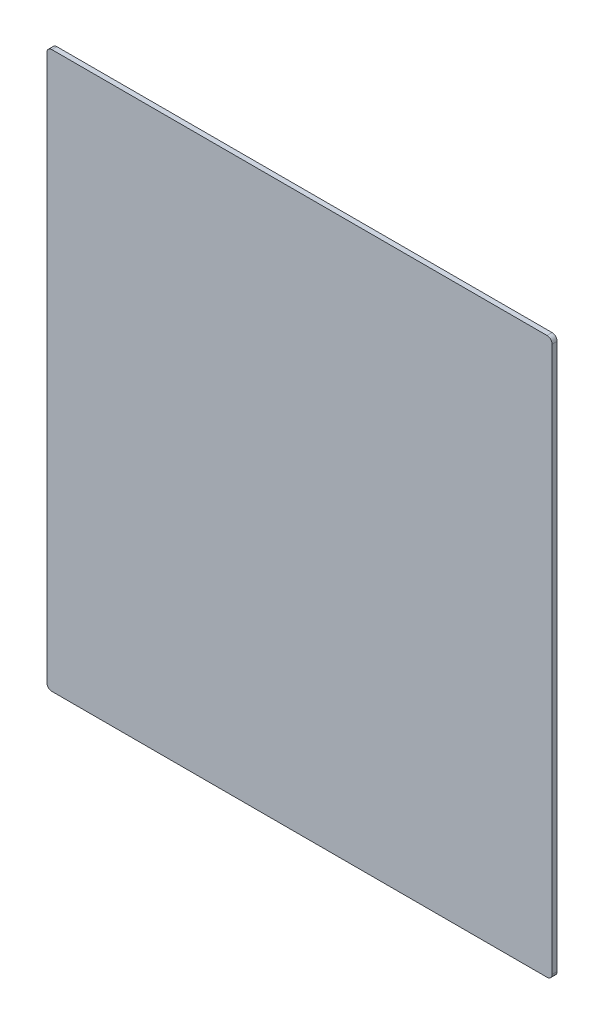
ISO-10303-21;
HEADER;
FILE_DESCRIPTION(('STEP AP214'),'2;1');
FILE_NAME('part.step','',(''),(''),'','','');
FILE_SCHEMA(('AUTOMOTIVE_DESIGN { 1 0 10303 214 1 1 1 1 }'));
ENDSEC;
DATA;
#1=APPLICATION_CONTEXT('core data for automotive mechanical design processes');
#2=APPLICATION_PROTOCOL_DEFINITION('international standard','automotive_design',2000,#1);
#3=PRODUCT_CONTEXT('',#1,'mechanical');
#4=PRODUCT('Part','Part','',(#3));
#5=PRODUCT_RELATED_PRODUCT_CATEGORY('part','',(#4));
#6=PRODUCT_DEFINITION_FORMATION('','',#4);
#7=PRODUCT_DEFINITION_CONTEXT('part definition',#1,'design');
#8=PRODUCT_DEFINITION('design','',#6,#7);
#9=PRODUCT_DEFINITION_SHAPE('','',#8);
#10=(LENGTH_UNIT() NAMED_UNIT(*) SI_UNIT(.MILLI.,.METRE.));
#11=(NAMED_UNIT(*) PLANE_ANGLE_UNIT() SI_UNIT($,.RADIAN.));
#12=(NAMED_UNIT(*) SI_UNIT($,.STERADIAN.) SOLID_ANGLE_UNIT());
#13=UNCERTAINTY_MEASURE_WITH_UNIT(LENGTH_MEASURE(1.E-05),#10,'distance_accuracy_value','');
#14=(GEOMETRIC_REPRESENTATION_CONTEXT(3) GLOBAL_UNCERTAINTY_ASSIGNED_CONTEXT((#13)) GLOBAL_UNIT_ASSIGNED_CONTEXT((#10,
#11,#12)) REPRESENTATION_CONTEXT('',''));
#15=CARTESIAN_POINT('',(0.,0.,0.));
#16=DIRECTION('',(0.,0.,1.));
#17=DIRECTION('',(1.,0.,0.));
#18=AXIS2_PLACEMENT_3D('',#15,#16,#17);
#19=CARTESIAN_POINT('',(0.,0.,3.));
#20=DIRECTION('',(1.,0.,0.));
#21=DIRECTION('',(0.,0.,-1.));
#22=AXIS2_PLACEMENT_3D('',#19,#20,#21);
#23=PLANE('',#22);
#24=DIRECTION('',(0.,-1.,0.));
#25=VECTOR('',#24,1.);
#26=CARTESIAN_POINT('',(0.,0.,0.));
#27=LINE('',#26,#25);
#28=CARTESIAN_POINT('',(0.,327.,0.));
#29=VERTEX_POINT('',#28);
#30=CARTESIAN_POINT('',(0.,3.,0.));
#31=VERTEX_POINT('',#30);
#32=EDGE_CURVE('E127',#29,#31,#27,.T.);
#33=ORIENTED_EDGE('',*,*,#32,.T.);
#34=DIRECTION('',(0.,0.,-1.));
#35=VECTOR('',#34,1.);
#36=CARTESIAN_POINT('',(0.,3.,3.));
#37=LINE('',#36,#35);
#38=CARTESIAN_POINT('',(0.,3.,3.));
#39=VERTEX_POINT('',#38);
#40=EDGE_CURVE('E105',#31,#39,#37,.F.);
#41=ORIENTED_EDGE('',*,*,#40,.T.);
#42=DIRECTION('',(0.,-1.,0.));
#43=VECTOR('',#42,1.);
#44=CARTESIAN_POINT('',(0.,0.,3.));
#45=LINE('',#44,#43);
#46=CARTESIAN_POINT('',(0.,327.,3.));
#47=VERTEX_POINT('',#46);
#48=EDGE_CURVE('E136',#47,#39,#45,.T.);
#49=ORIENTED_EDGE('',*,*,#48,.F.);
#50=DIRECTION('',(0.,0.,-1.));
#51=VECTOR('',#50,1.);
#52=CARTESIAN_POINT('',(0.,327.,3.));
#53=LINE('',#52,#51);
#54=EDGE_CURVE('E110',#47,#29,#53,.T.);
#55=ORIENTED_EDGE('',*,*,#54,.T.);
#56=EDGE_LOOP('',(#33,#41,#49,#55));
#57=FACE_BOUND('',#56,.T.);
#58=ADVANCED_FACE('F34',(#57),#23,.F.);
#59=CARTESIAN_POINT('',(0.,0.,3.));
#60=DIRECTION('',(0.,1.,0.));
#61=DIRECTION('',(0.,0.,1.));
#62=AXIS2_PLACEMENT_3D('',#59,#60,#61);
#63=PLANE('',#62);
#64=DIRECTION('',(1.,0.,0.));
#65=VECTOR('',#64,1.);
#66=CARTESIAN_POINT('',(0.,0.,3.));
#67=LINE('',#66,#65);
#68=CARTESIAN_POINT('',(3.,0.,3.));
#69=VERTEX_POINT('',#68);
#70=CARTESIAN_POINT('',(297.,0.,3.));
#71=VERTEX_POINT('',#70);
#72=EDGE_CURVE('E120',#69,#71,#67,.T.);
#73=ORIENTED_EDGE('',*,*,#72,.F.);
#74=DIRECTION('',(0.,0.,-1.));
#75=VECTOR('',#74,1.);
#76=CARTESIAN_POINT('',(3.,0.,3.));
#77=LINE('',#76,#75);
#78=CARTESIAN_POINT('',(3.,0.,0.));
#79=VERTEX_POINT('',#78);
#80=EDGE_CURVE('E104',#69,#79,#77,.T.);
#81=ORIENTED_EDGE('',*,*,#80,.T.);
#82=DIRECTION('',(1.,0.,0.));
#83=VECTOR('',#82,1.);
#84=CARTESIAN_POINT('',(0.,0.,0.));
#85=LINE('',#84,#83);
#86=CARTESIAN_POINT('',(297.,0.,0.));
#87=VERTEX_POINT('',#86);
#88=EDGE_CURVE('E117',#79,#87,#85,.T.);
#89=ORIENTED_EDGE('',*,*,#88,.T.);
#90=DIRECTION('',(0.,0.,-1.));
#91=VECTOR('',#90,1.);
#92=CARTESIAN_POINT('',(297.,0.,3.));
#93=LINE('',#92,#91);
#94=EDGE_CURVE('E122',#87,#71,#93,.F.);
#95=ORIENTED_EDGE('',*,*,#94,.T.);
#96=EDGE_LOOP('',(#73,#81,#89,#95));
#97=FACE_BOUND('',#96,.T.);
#98=ADVANCED_FACE('F116',(#97),#63,.F.);
#99=CARTESIAN_POINT('',(300.,0.,3.));
#100=DIRECTION('',(-1.,0.,0.));
#101=DIRECTION('',(0.,0.,1.));
#102=AXIS2_PLACEMENT_3D('',#99,#100,#101);
#103=PLANE('',#102);
#104=DIRECTION('',(0.,1.,0.));
#105=VECTOR('',#104,1.);
#106=CARTESIAN_POINT('',(300.,0.,3.));
#107=LINE('',#106,#105);
#108=CARTESIAN_POINT('',(300.,3.,3.));
#109=VERTEX_POINT('',#108);
#110=CARTESIAN_POINT('',(300.,327.,3.));
#111=VERTEX_POINT('',#110);
#112=EDGE_CURVE('E162',#109,#111,#107,.T.);
#113=ORIENTED_EDGE('',*,*,#112,.F.);
#114=DIRECTION('',(0.,0.,-1.));
#115=VECTOR('',#114,1.);
#116=CARTESIAN_POINT('',(300.,3.,3.));
#117=LINE('',#116,#115);
#118=CARTESIAN_POINT('',(300.,3.,0.));
#119=VERTEX_POINT('',#118);
#120=EDGE_CURVE('E155',#109,#119,#117,.T.);
#121=ORIENTED_EDGE('',*,*,#120,.T.);
#122=DIRECTION('',(0.,1.,0.));
#123=VECTOR('',#122,1.);
#124=CARTESIAN_POINT('',(300.,0.,0.));
#125=LINE('',#124,#123);
#126=CARTESIAN_POINT('',(300.,327.,0.));
#127=VERTEX_POINT('',#126);
#128=EDGE_CURVE('E126',#119,#127,#125,.T.);
#129=ORIENTED_EDGE('',*,*,#128,.T.);
#130=DIRECTION('',(0.,0.,-1.));
#131=VECTOR('',#130,1.);
#132=CARTESIAN_POINT('',(300.,327.,3.));
#133=LINE('',#132,#131);
#134=EDGE_CURVE('E153',#127,#111,#133,.F.);
#135=ORIENTED_EDGE('',*,*,#134,.T.);
#136=EDGE_LOOP('',(#113,#121,#129,#135));
#137=FACE_BOUND('',#136,.T.);
#138=ADVANCED_FACE('F160',(#137),#103,.F.);
#139=CARTESIAN_POINT('',(0.,330.,3.));
#140=DIRECTION('',(0.,-1.,0.));
#141=DIRECTION('',(0.,0.,-1.));
#142=AXIS2_PLACEMENT_3D('',#139,#140,#141);
#143=PLANE('',#142);
#144=DIRECTION('',(-1.,0.,0.));
#145=VECTOR('',#144,1.);
#146=CARTESIAN_POINT('',(0.,330.,3.));
#147=LINE('',#146,#145);
#148=CARTESIAN_POINT('',(297.,330.,3.));
#149=VERTEX_POINT('',#148);
#150=CARTESIAN_POINT('',(3.,330.,3.));
#151=VERTEX_POINT('',#150);
#152=EDGE_CURVE('E137',#149,#151,#147,.T.);
#153=ORIENTED_EDGE('',*,*,#152,.F.);
#154=DIRECTION('',(0.,0.,-1.));
#155=VECTOR('',#154,1.);
#156=CARTESIAN_POINT('',(297.,330.,3.));
#157=LINE('',#156,#155);
#158=CARTESIAN_POINT('',(297.,330.,0.));
#159=VERTEX_POINT('',#158);
#160=EDGE_CURVE('E11',#149,#159,#157,.T.);
#161=ORIENTED_EDGE('',*,*,#160,.T.);
#162=DIRECTION('',(-1.,0.,0.));
#163=VECTOR('',#162,1.);
#164=CARTESIAN_POINT('',(0.,330.,0.));
#165=LINE('',#164,#163);
#166=CARTESIAN_POINT('',(3.,330.,0.));
#167=VERTEX_POINT('',#166);
#168=EDGE_CURVE('E130',#159,#167,#165,.T.);
#169=ORIENTED_EDGE('',*,*,#168,.T.);
#170=DIRECTION('',(0.,0.,-1.));
#171=VECTOR('',#170,1.);
#172=CARTESIAN_POINT('',(3.,330.,3.));
#173=LINE('',#172,#171);
#174=EDGE_CURVE('E42',#167,#151,#173,.F.);
#175=ORIENTED_EDGE('',*,*,#174,.T.);
#176=EDGE_LOOP('',(#153,#161,#169,#175));
#177=FACE_BOUND('',#176,.T.);
#178=ADVANCED_FACE('F169',(#177),#143,.F.);
#179=CARTESIAN_POINT('',(0.,0.,3.));
#180=DIRECTION('',(0.,0.,-1.));
#181=DIRECTION('',(-1.,0.,0.));
#182=AXIS2_PLACEMENT_3D('',#179,#180,#181);
#183=PLANE('',#182);
#184=ORIENTED_EDGE('',*,*,#48,.T.);
#185=CARTESIAN_POINT('',(3.,3.,3.));
#186=DIRECTION('',(0.,0.,-1.));
#187=DIRECTION('',(-1.,0.,0.));
#188=AXIS2_PLACEMENT_3D('',#185,#186,#187);
#189=CIRCLE('',#188,3.);
#190=EDGE_CURVE('E151',#39,#69,#189,.F.);
#191=ORIENTED_EDGE('',*,*,#190,.T.);
#192=ORIENTED_EDGE('',*,*,#72,.T.);
#193=CARTESIAN_POINT('',(297.,3.,3.));
#194=DIRECTION('',(0.,0.,-1.));
#195=DIRECTION('',(-1.,0.,0.));
#196=AXIS2_PLACEMENT_3D('',#193,#194,#195);
#197=CIRCLE('',#196,3.);
#198=EDGE_CURVE('E149',#71,#109,#197,.F.);
#199=ORIENTED_EDGE('',*,*,#198,.T.);
#200=ORIENTED_EDGE('',*,*,#112,.T.);
#201=CARTESIAN_POINT('',(297.,327.,3.));
#202=DIRECTION('',(0.,0.,-1.));
#203=DIRECTION('',(-1.,0.,0.));
#204=AXIS2_PLACEMENT_3D('',#201,#202,#203);
#205=CIRCLE('',#204,3.);
#206=EDGE_CURVE('E55',#111,#149,#205,.F.);
#207=ORIENTED_EDGE('',*,*,#206,.T.);
#208=ORIENTED_EDGE('',*,*,#152,.T.);
#209=CARTESIAN_POINT('',(3.,327.,3.));
#210=DIRECTION('',(0.,0.,-1.));
#211=DIRECTION('',(-1.,0.,0.));
#212=AXIS2_PLACEMENT_3D('',#209,#210,#211);
#213=CIRCLE('',#212,3.);
#214=EDGE_CURVE('E146',#151,#47,#213,.F.);
#215=ORIENTED_EDGE('',*,*,#214,.T.);
#216=EDGE_LOOP('',(#184,#191,#192,#199,#200,#207,#208,#215));
#217=FACE_BOUND('',#216,.T.);
#218=ADVANCED_FACE('F176',(#217),#183,.F.);
#219=CARTESIAN_POINT('',(0.,0.,0.));
#220=DIRECTION('',(0.,0.,-1.));
#221=DIRECTION('',(-1.,0.,0.));
#222=AXIS2_PLACEMENT_3D('',#219,#220,#221);
#223=PLANE('',#222);
#224=ORIENTED_EDGE('',*,*,#88,.F.);
#225=CARTESIAN_POINT('',(3.,3.,0.));
#226=DIRECTION('',(0.,0.,-1.));
#227=DIRECTION('',(-1.,0.,0.));
#228=AXIS2_PLACEMENT_3D('',#225,#226,#227);
#229=CIRCLE('',#228,3.);
#230=EDGE_CURVE('E100',#79,#31,#229,.T.);
#231=ORIENTED_EDGE('',*,*,#230,.T.);
#232=ORIENTED_EDGE('',*,*,#32,.F.);
#233=CARTESIAN_POINT('',(3.,327.,0.));
#234=DIRECTION('',(0.,0.,-1.));
#235=DIRECTION('',(-1.,0.,0.));
#236=AXIS2_PLACEMENT_3D('',#233,#234,#235);
#237=CIRCLE('',#236,3.);
#238=EDGE_CURVE('E121',#29,#167,#237,.T.);
#239=ORIENTED_EDGE('',*,*,#238,.T.);
#240=ORIENTED_EDGE('',*,*,#168,.F.);
#241=CARTESIAN_POINT('',(297.,327.,0.));
#242=DIRECTION('',(0.,0.,-1.));
#243=DIRECTION('',(-1.,0.,0.));
#244=AXIS2_PLACEMENT_3D('',#241,#242,#243);
#245=CIRCLE('',#244,3.);
#246=EDGE_CURVE('E140',#159,#127,#245,.T.);
#247=ORIENTED_EDGE('',*,*,#246,.T.);
#248=ORIENTED_EDGE('',*,*,#128,.F.);
#249=CARTESIAN_POINT('',(297.,3.,0.));
#250=DIRECTION('',(0.,0.,-1.));
#251=DIRECTION('',(-1.,0.,0.));
#252=AXIS2_PLACEMENT_3D('',#249,#250,#251);
#253=CIRCLE('',#252,3.);
#254=EDGE_CURVE('E111',#119,#87,#253,.T.);
#255=ORIENTED_EDGE('',*,*,#254,.T.);
#256=EDGE_LOOP('',(#224,#231,#232,#239,#240,#247,#248,#255));
#257=FACE_BOUND('',#256,.T.);
#258=ADVANCED_FACE('F124',(#257),#223,.T.);
#259=CARTESIAN_POINT('',(3.,3.,3.));
#260=DIRECTION('',(0.,0.,-1.));
#261=DIRECTION('',(-1.,0.,0.));
#262=AXIS2_PLACEMENT_3D('',#259,#260,#261);
#263=CYLINDRICAL_SURFACE('',#262,3.);
#264=ORIENTED_EDGE('',*,*,#190,.F.);
#265=ORIENTED_EDGE('',*,*,#40,.F.);
#266=ORIENTED_EDGE('',*,*,#230,.F.);
#267=ORIENTED_EDGE('',*,*,#80,.F.);
#268=EDGE_LOOP('',(#264,#265,#266,#267));
#269=FACE_BOUND('',#268,.T.);
#270=ADVANCED_FACE('F103',(#269),#263,.T.);
#271=CARTESIAN_POINT('',(297.,3.,3.));
#272=DIRECTION('',(0.,0.,-1.));
#273=DIRECTION('',(-1.,0.,0.));
#274=AXIS2_PLACEMENT_3D('',#271,#272,#273);
#275=CYLINDRICAL_SURFACE('',#274,3.);
#276=ORIENTED_EDGE('',*,*,#198,.F.);
#277=ORIENTED_EDGE('',*,*,#94,.F.);
#278=ORIENTED_EDGE('',*,*,#254,.F.);
#279=ORIENTED_EDGE('',*,*,#120,.F.);
#280=EDGE_LOOP('',(#276,#277,#278,#279));
#281=FACE_BOUND('',#280,.T.);
#282=ADVANCED_FACE('F184',(#281),#275,.T.);
#283=CARTESIAN_POINT('',(297.,327.,3.));
#284=DIRECTION('',(0.,0.,-1.));
#285=DIRECTION('',(-1.,0.,0.));
#286=AXIS2_PLACEMENT_3D('',#283,#284,#285);
#287=CYLINDRICAL_SURFACE('',#286,3.);
#288=ORIENTED_EDGE('',*,*,#206,.F.);
#289=ORIENTED_EDGE('',*,*,#134,.F.);
#290=ORIENTED_EDGE('',*,*,#246,.F.);
#291=ORIENTED_EDGE('',*,*,#160,.F.);
#292=EDGE_LOOP('',(#288,#289,#290,#291));
#293=FACE_BOUND('',#292,.T.);
#294=ADVANCED_FACE('F168',(#293),#287,.T.);
#295=CARTESIAN_POINT('',(3.,327.,3.));
#296=DIRECTION('',(0.,0.,-1.));
#297=DIRECTION('',(-1.,0.,0.));
#298=AXIS2_PLACEMENT_3D('',#295,#296,#297);
#299=CYLINDRICAL_SURFACE('',#298,3.);
#300=ORIENTED_EDGE('',*,*,#214,.F.);
#301=ORIENTED_EDGE('',*,*,#174,.F.);
#302=ORIENTED_EDGE('',*,*,#238,.F.);
#303=ORIENTED_EDGE('',*,*,#54,.F.);
#304=EDGE_LOOP('',(#300,#301,#302,#303));
#305=FACE_BOUND('',#304,.T.);
#306=ADVANCED_FACE('F36',(#305),#299,.T.);
#307=CLOSED_SHELL('',(#58,#98,#138,#178,#218,#258,#270,#282,#294,#306));
#308=MANIFOLD_SOLID_BREP('B2',#307);
#309=ADVANCED_BREP_SHAPE_REPRESENTATION('',(#18,#308),#14);
#310=SHAPE_DEFINITION_REPRESENTATION(#9,#309);
ENDSEC;
END-ISO-10303-21;
